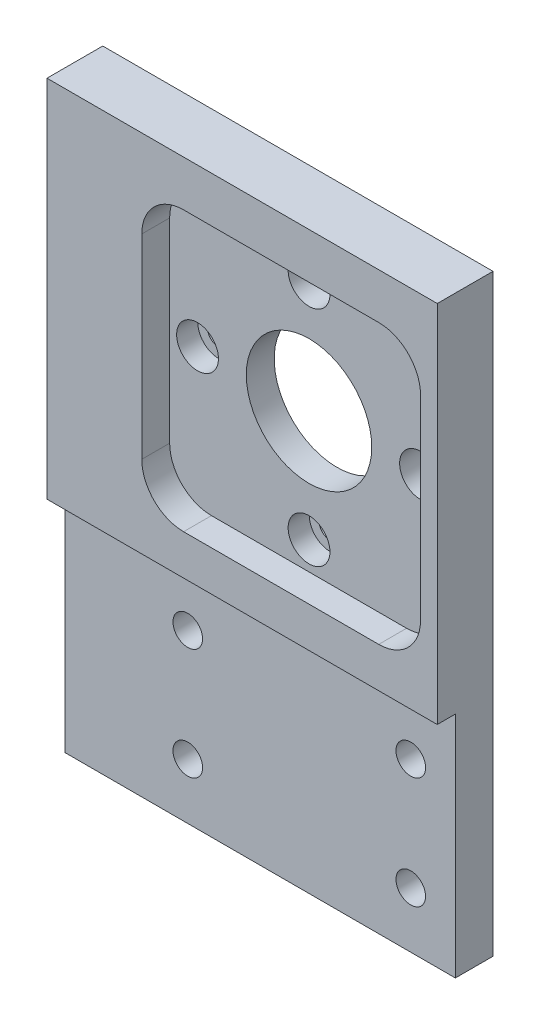
ISO-10303-21;
HEADER;
FILE_DESCRIPTION(('STEP AP214'),'2;1');
FILE_NAME('part.step','',(''),(''),'','','');
FILE_SCHEMA(('AUTOMOTIVE_DESIGN { 1 0 10303 214 1 1 1 1 }'));
ENDSEC;
DATA;
#1=APPLICATION_CONTEXT('core data for automotive mechanical design processes');
#2=APPLICATION_PROTOCOL_DEFINITION('international standard','automotive_design',2000,#1);
#3=PRODUCT_CONTEXT('',#1,'mechanical');
#4=PRODUCT('Part','Part','',(#3));
#5=PRODUCT_RELATED_PRODUCT_CATEGORY('part','',(#4));
#6=PRODUCT_DEFINITION_FORMATION('','',#4);
#7=PRODUCT_DEFINITION_CONTEXT('part definition',#1,'design');
#8=PRODUCT_DEFINITION('design','',#6,#7);
#9=PRODUCT_DEFINITION_SHAPE('','',#8);
#10=(LENGTH_UNIT() NAMED_UNIT(*) SI_UNIT(.MILLI.,.METRE.));
#11=(NAMED_UNIT(*) PLANE_ANGLE_UNIT() SI_UNIT($,.RADIAN.));
#12=(NAMED_UNIT(*) SI_UNIT($,.STERADIAN.) SOLID_ANGLE_UNIT());
#13=UNCERTAINTY_MEASURE_WITH_UNIT(LENGTH_MEASURE(1.E-05),#10,'distance_accuracy_value','');
#14=(GEOMETRIC_REPRESENTATION_CONTEXT(3) GLOBAL_UNCERTAINTY_ASSIGNED_CONTEXT((#13)) GLOBAL_UNIT_ASSIGNED_CONTEXT((#10,
#11,#12)) REPRESENTATION_CONTEXT('',''));
#15=CARTESIAN_POINT('',(0.,0.,0.));
#16=DIRECTION('',(0.,0.,1.));
#17=DIRECTION('',(1.,0.,0.));
#18=AXIS2_PLACEMENT_3D('',#15,#16,#17);
#19=CARTESIAN_POINT('',(0.,0.,12.7));
#20=DIRECTION('',(1.,0.,0.));
#21=DIRECTION('',(0.,1.,0.));
#22=AXIS2_PLACEMENT_3D('',#19,#20,#21);
#23=PLANE('',#22);
#24=DIRECTION('',(0.,-1.,0.));
#25=VECTOR('',#24,1.);
#26=CARTESIAN_POINT('',(0.,-135.128,8.5725));
#27=LINE('',#26,#25);
#28=CARTESIAN_POINT('',(0.,-83.058,8.5725));
#29=VERTEX_POINT('',#28);
#30=CARTESIAN_POINT('',(0.,-135.128,8.5725));
#31=VERTEX_POINT('',#30);
#32=EDGE_CURVE('E135',#29,#31,#27,.T.);
#33=ORIENTED_EDGE('',*,*,#32,.F.);
#34=DIRECTION('',(0.,0.,1.));
#35=VECTOR('',#34,1.);
#36=CARTESIAN_POINT('',(0.,-83.058,8.5725));
#37=LINE('',#36,#35);
#38=CARTESIAN_POINT('',(0.,-83.058,12.7));
#39=VERTEX_POINT('',#38);
#40=EDGE_CURVE('E305',#29,#39,#37,.T.);
#41=ORIENTED_EDGE('',*,*,#40,.T.);
#42=DIRECTION('',(0.,-1.,0.));
#43=VECTOR('',#42,1.);
#44=CARTESIAN_POINT('',(0.,0.,12.7));
#45=LINE('',#44,#43);
#46=CARTESIAN_POINT('',(0.,0.,12.7));
#47=VERTEX_POINT('',#46);
#48=EDGE_CURVE('E272',#47,#39,#45,.T.);
#49=ORIENTED_EDGE('',*,*,#48,.F.);
#50=DIRECTION('',(0.,0.,-1.));
#51=VECTOR('',#50,1.);
#52=CARTESIAN_POINT('',(0.,0.,12.7));
#53=LINE('',#52,#51);
#54=CARTESIAN_POINT('',(0.,0.,0.));
#55=VERTEX_POINT('',#54);
#56=EDGE_CURVE('E280',#47,#55,#53,.T.);
#57=ORIENTED_EDGE('',*,*,#56,.T.);
#58=DIRECTION('',(0.,-1.,0.));
#59=VECTOR('',#58,1.);
#60=CARTESIAN_POINT('',(0.,0.,0.));
#61=LINE('',#60,#59);
#62=CARTESIAN_POINT('',(0.,-135.128,0.));
#63=VERTEX_POINT('',#62);
#64=EDGE_CURVE('E159',#55,#63,#61,.T.);
#65=ORIENTED_EDGE('',*,*,#64,.T.);
#66=DIRECTION('',(0.,0.,-1.));
#67=VECTOR('',#66,1.);
#68=CARTESIAN_POINT('',(0.,-135.128,12.7));
#69=LINE('',#68,#67);
#70=EDGE_CURVE('E151',#31,#63,#69,.T.);
#71=ORIENTED_EDGE('',*,*,#70,.F.);
#72=EDGE_LOOP('',(#33,#41,#49,#57,#65,#71));
#73=FACE_BOUND('',#72,.T.);
#74=ADVANCED_FACE('F33',(#73),#23,.F.);
#75=CARTESIAN_POINT('',(0.,-135.128,12.7));
#76=DIRECTION('',(0.,1.,0.));
#77=DIRECTION('',(0.,0.,1.));
#78=AXIS2_PLACEMENT_3D('',#75,#76,#77);
#79=PLANE('',#78);
#80=DIRECTION('',(0.,0.,-1.));
#81=VECTOR('',#80,1.);
#82=CARTESIAN_POINT('',(88.9,-135.128,12.7));
#83=LINE('',#82,#81);
#84=CARTESIAN_POINT('',(88.9,-135.128,8.5725));
#85=VERTEX_POINT('',#84);
#86=CARTESIAN_POINT('',(88.9,-135.128,0.));
#87=VERTEX_POINT('',#86);
#88=EDGE_CURVE('E153',#85,#87,#83,.T.);
#89=ORIENTED_EDGE('',*,*,#88,.F.);
#90=DIRECTION('',(1.,0.,0.));
#91=VECTOR('',#90,1.);
#92=CARTESIAN_POINT('',(0.,-135.128,8.5725));
#93=LINE('',#92,#91);
#94=EDGE_CURVE('E139',#31,#85,#93,.T.);
#95=ORIENTED_EDGE('',*,*,#94,.F.);
#96=ORIENTED_EDGE('',*,*,#70,.T.);
#97=DIRECTION('',(1.,0.,0.));
#98=VECTOR('',#97,1.);
#99=CARTESIAN_POINT('',(0.,-135.128,0.));
#100=LINE('',#99,#98);
#101=EDGE_CURVE('E282',#63,#87,#100,.T.);
#102=ORIENTED_EDGE('',*,*,#101,.T.);
#103=EDGE_LOOP('',(#89,#95,#96,#102));
#104=FACE_BOUND('',#103,.T.);
#105=ADVANCED_FACE('F149',(#104),#79,.F.);
#106=CARTESIAN_POINT('',(88.9,0.,12.7));
#107=DIRECTION('',(-1.,0.,0.));
#108=DIRECTION('',(0.,-1.,0.));
#109=AXIS2_PLACEMENT_3D('',#106,#107,#108);
#110=PLANE('',#109);
#111=DIRECTION('',(0.,1.,0.));
#112=VECTOR('',#111,1.);
#113=CARTESIAN_POINT('',(88.9,0.,12.7));
#114=LINE('',#113,#112);
#115=CARTESIAN_POINT('',(88.9,-83.058,12.7));
#116=VERTEX_POINT('',#115);
#117=CARTESIAN_POINT('',(88.9,0.,12.7));
#118=VERTEX_POINT('',#117);
#119=EDGE_CURVE('E275',#116,#118,#114,.T.);
#120=ORIENTED_EDGE('',*,*,#119,.F.);
#121=DIRECTION('',(0.,0.,1.));
#122=VECTOR('',#121,1.);
#123=CARTESIAN_POINT('',(88.9,-83.058,8.5725));
#124=LINE('',#123,#122);
#125=CARTESIAN_POINT('',(88.9,-83.058,8.5725));
#126=VERTEX_POINT('',#125);
#127=EDGE_CURVE('E49',#126,#116,#124,.T.);
#128=ORIENTED_EDGE('',*,*,#127,.F.);
#129=DIRECTION('',(0.,1.,0.));
#130=VECTOR('',#129,1.);
#131=CARTESIAN_POINT('',(88.9,-135.128,8.5725));
#132=LINE('',#131,#130);
#133=EDGE_CURVE('E154',#85,#126,#132,.T.);
#134=ORIENTED_EDGE('',*,*,#133,.F.);
#135=ORIENTED_EDGE('',*,*,#88,.T.);
#136=DIRECTION('',(0.,1.,0.));
#137=VECTOR('',#136,1.);
#138=CARTESIAN_POINT('',(88.9,0.,0.));
#139=LINE('',#138,#137);
#140=CARTESIAN_POINT('',(88.9,0.,0.));
#141=VERTEX_POINT('',#140);
#142=EDGE_CURVE('E284',#87,#141,#139,.T.);
#143=ORIENTED_EDGE('',*,*,#142,.T.);
#144=DIRECTION('',(0.,0.,-1.));
#145=VECTOR('',#144,1.);
#146=CARTESIAN_POINT('',(88.9,0.,12.7));
#147=LINE('',#146,#145);
#148=EDGE_CURVE('E164',#118,#141,#147,.T.);
#149=ORIENTED_EDGE('',*,*,#148,.F.);
#150=EDGE_LOOP('',(#120,#128,#134,#135,#143,#149));
#151=FACE_BOUND('',#150,.T.);
#152=ADVANCED_FACE('F299',(#151),#110,.F.);
#153=CARTESIAN_POINT('',(0.,0.,12.7));
#154=DIRECTION('',(0.,-1.,0.));
#155=DIRECTION('',(0.,0.,-1.));
#156=AXIS2_PLACEMENT_3D('',#153,#154,#155);
#157=PLANE('',#156);
#158=DIRECTION('',(-1.,0.,0.));
#159=VECTOR('',#158,1.);
#160=CARTESIAN_POINT('',(0.,0.,0.));
#161=LINE('',#160,#159);
#162=EDGE_CURVE('E276',#141,#55,#161,.T.);
#163=ORIENTED_EDGE('',*,*,#162,.T.);
#164=ORIENTED_EDGE('',*,*,#56,.F.);
#165=DIRECTION('',(-1.,0.,0.));
#166=VECTOR('',#165,1.);
#167=CARTESIAN_POINT('',(0.,0.,12.7));
#168=LINE('',#167,#166);
#169=EDGE_CURVE('E278',#118,#47,#168,.T.);
#170=ORIENTED_EDGE('',*,*,#169,.F.);
#171=ORIENTED_EDGE('',*,*,#148,.T.);
#172=EDGE_LOOP('',(#163,#164,#170,#171));
#173=FACE_BOUND('',#172,.T.);
#174=ADVANCED_FACE('F292',(#173),#157,.F.);
#175=CARTESIAN_POINT('',(0.,0.,12.7));
#176=DIRECTION('',(0.,0.,1.));
#177=DIRECTION('',(1.,0.,0.));
#178=AXIS2_PLACEMENT_3D('',#175,#176,#177);
#179=PLANE('',#178);
#180=DIRECTION('',(-1.,0.,0.));
#181=VECTOR('',#180,1.);
#182=CARTESIAN_POINT('',(0.,-83.058,12.7));
#183=LINE('',#182,#181);
#184=EDGE_CURVE('E145',#116,#39,#183,.T.);
#185=ORIENTED_EDGE('',*,*,#184,.F.);
#186=ORIENTED_EDGE('',*,*,#119,.T.);
#187=ORIENTED_EDGE('',*,*,#169,.T.);
#188=ORIENTED_EDGE('',*,*,#48,.T.);
#189=EDGE_LOOP('',(#185,#186,#187,#188));
#190=FACE_BOUND('',#189,.T.);
#191=DIRECTION('',(0.,1.,0.));
#192=VECTOR('',#191,1.);
#193=CARTESIAN_POINT('',(85.09,-73.914,12.7));
#194=LINE('',#193,#192);
#195=CARTESIAN_POINT('',(85.09,-64.389,12.7));
#196=VERTEX_POINT('',#195);
#197=CARTESIAN_POINT('',(85.09,-19.939,12.7));
#198=VERTEX_POINT('',#197);
#199=EDGE_CURVE('E200',#196,#198,#194,.T.);
#200=ORIENTED_EDGE('',*,*,#199,.F.);
#201=CARTESIAN_POINT('',(75.565,-64.389,12.7));
#202=DIRECTION('',(0.,0.,1.));
#203=DIRECTION('',(1.,0.,0.));
#204=AXIS2_PLACEMENT_3D('',#201,#202,#203);
#205=CIRCLE('',#204,9.525);
#206=CARTESIAN_POINT('',(75.565,-73.914,12.7));
#207=VERTEX_POINT('',#206);
#208=EDGE_CURVE('E195',#196,#207,#205,.F.);
#209=ORIENTED_EDGE('',*,*,#208,.T.);
#210=DIRECTION('',(1.,0.,0.));
#211=VECTOR('',#210,1.);
#212=CARTESIAN_POINT('',(21.59,-73.914,12.7));
#213=LINE('',#212,#211);
#214=CARTESIAN_POINT('',(31.115,-73.914,12.7));
#215=VERTEX_POINT('',#214);
#216=EDGE_CURVE('E230',#215,#207,#213,.T.);
#217=ORIENTED_EDGE('',*,*,#216,.F.);
#218=CARTESIAN_POINT('',(31.115,-64.389,12.7));
#219=DIRECTION('',(0.,0.,1.));
#220=DIRECTION('',(1.,0.,0.));
#221=AXIS2_PLACEMENT_3D('',#218,#219,#220);
#222=CIRCLE('',#221,9.525);
#223=CARTESIAN_POINT('',(21.59,-64.389,12.7));
#224=VERTEX_POINT('',#223);
#225=EDGE_CURVE('E193',#215,#224,#222,.F.);
#226=ORIENTED_EDGE('',*,*,#225,.T.);
#227=DIRECTION('',(0.,-1.,0.));
#228=VECTOR('',#227,1.);
#229=CARTESIAN_POINT('',(21.59,-73.914,12.7));
#230=LINE('',#229,#228);
#231=CARTESIAN_POINT('',(21.59,-19.939,12.7));
#232=VERTEX_POINT('',#231);
#233=EDGE_CURVE('E238',#232,#224,#230,.T.);
#234=ORIENTED_EDGE('',*,*,#233,.F.);
#235=CARTESIAN_POINT('',(31.115,-19.939,12.7));
#236=DIRECTION('',(0.,0.,1.));
#237=DIRECTION('',(1.,0.,0.));
#238=AXIS2_PLACEMENT_3D('',#235,#236,#237);
#239=CIRCLE('',#238,9.525);
#240=CARTESIAN_POINT('',(31.115,-10.414,12.7));
#241=VERTEX_POINT('',#240);
#242=EDGE_CURVE('E11',#232,#241,#239,.F.);
#243=ORIENTED_EDGE('',*,*,#242,.T.);
#244=DIRECTION('',(-1.,0.,0.));
#245=VECTOR('',#244,1.);
#246=CARTESIAN_POINT('',(21.59,-10.414,12.7));
#247=LINE('',#246,#245);
#248=CARTESIAN_POINT('',(75.565,-10.414,12.7));
#249=VERTEX_POINT('',#248);
#250=EDGE_CURVE('E201',#249,#241,#247,.T.);
#251=ORIENTED_EDGE('',*,*,#250,.F.);
#252=CARTESIAN_POINT('',(75.565,-19.939,12.7));
#253=DIRECTION('',(0.,0.,1.));
#254=DIRECTION('',(1.,0.,0.));
#255=AXIS2_PLACEMENT_3D('',#252,#253,#254);
#256=CIRCLE('',#255,9.525);
#257=EDGE_CURVE('E42',#249,#198,#256,.F.);
#258=ORIENTED_EDGE('',*,*,#257,.T.);
#259=EDGE_LOOP('',(#200,#209,#217,#226,#234,#243,#251,#258));
#260=FACE_BOUND('',#259,.T.);
#261=ADVANCED_FACE('F199',(#190,#260),#179,.T.);
#262=CARTESIAN_POINT('',(0.,0.,0.));
#263=DIRECTION('',(0.,0.,1.));
#264=DIRECTION('',(1.,0.,0.));
#265=AXIS2_PLACEMENT_3D('',#262,#263,#264);
#266=PLANE('',#265);
#267=CARTESIAN_POINT('',(27.94,-122.428,0.));
#268=DIRECTION('',(0.,0.,1.));
#269=DIRECTION('',(1.,0.,0.));
#270=AXIS2_PLACEMENT_3D('',#267,#268,#269);
#271=CIRCLE('',#270,3.37343750000001);
#272=CARTESIAN_POINT('',(31.3134375,-122.428,0.));
#273=VERTEX_POINT('',#272);
#274=EDGE_CURVE('E246',#273,#273,#271,.T.);
#275=ORIENTED_EDGE('',*,*,#274,.T.);
#276=EDGE_LOOP('',(#275));
#277=FACE_BOUND('',#276,.T.);
#278=CARTESIAN_POINT('',(78.74,-97.028,0.));
#279=DIRECTION('',(0.,0.,1.));
#280=DIRECTION('',(1.,0.,0.));
#281=AXIS2_PLACEMENT_3D('',#278,#279,#280);
#282=CIRCLE('',#281,3.3734375);
#283=CARTESIAN_POINT('',(82.1134375,-97.028,0.));
#284=VERTEX_POINT('',#283);
#285=EDGE_CURVE('E250',#284,#284,#282,.T.);
#286=ORIENTED_EDGE('',*,*,#285,.T.);
#287=EDGE_LOOP('',(#286));
#288=FACE_BOUND('',#287,.T.);
#289=CARTESIAN_POINT('',(27.94,-97.028,0.));
#290=DIRECTION('',(0.,0.,1.));
#291=DIRECTION('',(1.,0.,0.));
#292=AXIS2_PLACEMENT_3D('',#289,#290,#291);
#293=CIRCLE('',#292,3.37343750000001);
#294=CARTESIAN_POINT('',(31.3134375,-97.028,0.));
#295=VERTEX_POINT('',#294);
#296=EDGE_CURVE('E245',#295,#295,#293,.T.);
#297=ORIENTED_EDGE('',*,*,#296,.T.);
#298=EDGE_LOOP('',(#297));
#299=FACE_BOUND('',#298,.T.);
#300=CARTESIAN_POINT('',(78.74,-122.428,0.));
#301=DIRECTION('',(0.,0.,1.));
#302=DIRECTION('',(1.,0.,0.));
#303=AXIS2_PLACEMENT_3D('',#300,#301,#302);
#304=CIRCLE('',#303,3.3734375);
#305=CARTESIAN_POINT('',(82.1134375,-122.428,0.));
#306=VERTEX_POINT('',#305);
#307=EDGE_CURVE('E249',#306,#306,#304,.T.);
#308=ORIENTED_EDGE('',*,*,#307,.T.);
#309=EDGE_LOOP('',(#308));
#310=FACE_BOUND('',#309,.T.);
#311=CARTESIAN_POINT('',(53.34,-16.764,0.));
#312=DIRECTION('',(0.,0.,1.));
#313=DIRECTION('',(1.,0.,0.));
#314=AXIS2_PLACEMENT_3D('',#311,#312,#313);
#315=CIRCLE('',#314,2.5527);
#316=CARTESIAN_POINT('',(55.8927,-16.764,0.));
#317=VERTEX_POINT('',#316);
#318=EDGE_CURVE('E257',#317,#317,#315,.T.);
#319=ORIENTED_EDGE('',*,*,#318,.T.);
#320=EDGE_LOOP('',(#319));
#321=FACE_BOUND('',#320,.T.);
#322=CARTESIAN_POINT('',(53.34,-67.564,0.));
#323=DIRECTION('',(0.,0.,1.));
#324=DIRECTION('',(1.,0.,0.));
#325=AXIS2_PLACEMENT_3D('',#322,#323,#324);
#326=CIRCLE('',#325,2.5527);
#327=CARTESIAN_POINT('',(55.8927,-67.564,0.));
#328=VERTEX_POINT('',#327);
#329=EDGE_CURVE('E260',#328,#328,#326,.T.);
#330=ORIENTED_EDGE('',*,*,#329,.T.);
#331=EDGE_LOOP('',(#330));
#332=FACE_BOUND('',#331,.T.);
#333=CARTESIAN_POINT('',(27.94,-42.164,0.));
#334=DIRECTION('',(0.,0.,1.));
#335=DIRECTION('',(1.,0.,0.));
#336=AXIS2_PLACEMENT_3D('',#333,#334,#335);
#337=CIRCLE('',#336,2.5527);
#338=CARTESIAN_POINT('',(30.4927,-42.164,0.));
#339=VERTEX_POINT('',#338);
#340=EDGE_CURVE('E263',#339,#339,#337,.T.);
#341=ORIENTED_EDGE('',*,*,#340,.T.);
#342=EDGE_LOOP('',(#341));
#343=FACE_BOUND('',#342,.T.);
#344=CARTESIAN_POINT('',(78.74,-42.164,0.));
#345=DIRECTION('',(0.,0.,1.));
#346=DIRECTION('',(1.,0.,0.));
#347=AXIS2_PLACEMENT_3D('',#344,#345,#346);
#348=CIRCLE('',#347,2.55269999999999);
#349=CARTESIAN_POINT('',(81.2927,-42.164,0.));
#350=VERTEX_POINT('',#349);
#351=EDGE_CURVE('E266',#350,#350,#348,.T.);
#352=ORIENTED_EDGE('',*,*,#351,.T.);
#353=EDGE_LOOP('',(#352));
#354=FACE_BOUND('',#353,.T.);
#355=CARTESIAN_POINT('',(53.34,-42.164,0.));
#356=DIRECTION('',(0.,0.,1.));
#357=DIRECTION('',(1.,0.,0.));
#358=AXIS2_PLACEMENT_3D('',#355,#356,#357);
#359=CIRCLE('',#358,14.2875);
#360=CARTESIAN_POINT('',(67.6275,-42.164,0.));
#361=VERTEX_POINT('',#360);
#362=EDGE_CURVE('E269',#361,#361,#359,.T.);
#363=ORIENTED_EDGE('',*,*,#362,.T.);
#364=EDGE_LOOP('',(#363));
#365=FACE_BOUND('',#364,.T.);
#366=ORIENTED_EDGE('',*,*,#64,.F.);
#367=ORIENTED_EDGE('',*,*,#162,.F.);
#368=ORIENTED_EDGE('',*,*,#142,.F.);
#369=ORIENTED_EDGE('',*,*,#101,.F.);
#370=EDGE_LOOP('',(#366,#367,#368,#369));
#371=FACE_BOUND('',#370,.T.);
#372=ADVANCED_FACE('F298',(#277,#288,#299,#310,#321,#332,#343,#354,#365,#371),#266,.F.);
#373=CARTESIAN_POINT('',(53.34,-42.164,0.));
#374=DIRECTION('',(0.,0.,1.));
#375=DIRECTION('',(1.,0.,0.));
#376=AXIS2_PLACEMENT_3D('',#373,#374,#375);
#377=CYLINDRICAL_SURFACE('',#376,14.2875);
#378=CARTESIAN_POINT('',(53.34,-42.164,6.35));
#379=DIRECTION('',(0.,0.,-1.));
#380=DIRECTION('',(-1.,0.,0.));
#381=AXIS2_PLACEMENT_3D('',#378,#379,#380);
#382=CIRCLE('',#381,14.2875);
#383=CARTESIAN_POINT('',(39.0525,-42.164,6.35));
#384=VERTEX_POINT('',#383);
#385=EDGE_CURVE('E235',#384,#384,#382,.F.);
#386=ORIENTED_EDGE('',*,*,#385,.T.);
#387=EDGE_LOOP('',(#386));
#388=FACE_BOUND('',#387,.T.);
#389=ORIENTED_EDGE('',*,*,#362,.F.);
#390=EDGE_LOOP('',(#389));
#391=FACE_BOUND('',#390,.T.);
#392=ADVANCED_FACE('F453',(#388,#391),#377,.F.);
#393=CARTESIAN_POINT('',(78.74,-42.164,12.7));
#394=DIRECTION('',(0.,0.,1.));
#395=DIRECTION('',(1.,0.,0.));
#396=AXIS2_PLACEMENT_3D('',#393,#394,#395);
#397=CYLINDRICAL_SURFACE('',#396,2.5527);
#398=CARTESIAN_POINT('',(78.74,-42.164,1.524));
#399=DIRECTION('',(0.,0.,1.));
#400=DIRECTION('',(1.,0.,0.));
#401=AXIS2_PLACEMENT_3D('',#398,#399,#400);
#402=CIRCLE('',#401,2.55269999999999);
#403=CARTESIAN_POINT('',(81.2927,-42.164,1.524));
#404=VERTEX_POINT('',#403);
#405=EDGE_CURVE('E590',#404,#404,#402,.T.);
#406=ORIENTED_EDGE('',*,*,#405,.T.);
#407=EDGE_LOOP('',(#406));
#408=FACE_BOUND('',#407,.T.);
#409=ORIENTED_EDGE('',*,*,#351,.F.);
#410=EDGE_LOOP('',(#409));
#411=FACE_BOUND('',#410,.T.);
#412=ADVANCED_FACE('F447',(#408,#411),#397,.F.);
#413=CARTESIAN_POINT('',(27.94,-42.164,12.7));
#414=DIRECTION('',(0.,0.,1.));
#415=DIRECTION('',(1.,0.,0.));
#416=AXIS2_PLACEMENT_3D('',#413,#414,#415);
#417=CYLINDRICAL_SURFACE('',#416,2.5527);
#418=CARTESIAN_POINT('',(27.94,-42.164,1.524));
#419=DIRECTION('',(0.,0.,1.));
#420=DIRECTION('',(1.,0.,0.));
#421=AXIS2_PLACEMENT_3D('',#418,#419,#420);
#422=CIRCLE('',#421,2.55269999999999);
#423=CARTESIAN_POINT('',(30.4927,-42.164,1.524));
#424=VERTEX_POINT('',#423);
#425=EDGE_CURVE('E304',#424,#424,#422,.T.);
#426=ORIENTED_EDGE('',*,*,#425,.T.);
#427=EDGE_LOOP('',(#426));
#428=FACE_BOUND('',#427,.T.);
#429=ORIENTED_EDGE('',*,*,#340,.F.);
#430=EDGE_LOOP('',(#429));
#431=FACE_BOUND('',#430,.T.);
#432=ADVANCED_FACE('F452',(#428,#431),#417,.F.);
#433=CARTESIAN_POINT('',(53.34,-67.564,12.7));
#434=DIRECTION('',(0.,0.,1.));
#435=DIRECTION('',(1.,0.,0.));
#436=AXIS2_PLACEMENT_3D('',#433,#434,#435);
#437=CYLINDRICAL_SURFACE('',#436,2.5527);
#438=CARTESIAN_POINT('',(53.34,-67.564,1.524));
#439=DIRECTION('',(0.,0.,1.));
#440=DIRECTION('',(1.,0.,0.));
#441=AXIS2_PLACEMENT_3D('',#438,#439,#440);
#442=CIRCLE('',#441,2.5527);
#443=CARTESIAN_POINT('',(55.8927,-67.564,1.524));
#444=VERTEX_POINT('',#443);
#445=EDGE_CURVE('E599',#444,#444,#442,.T.);
#446=ORIENTED_EDGE('',*,*,#445,.T.);
#447=EDGE_LOOP('',(#446));
#448=FACE_BOUND('',#447,.T.);
#449=ORIENTED_EDGE('',*,*,#329,.F.);
#450=EDGE_LOOP('',(#449));
#451=FACE_BOUND('',#450,.T.);
#452=ADVANCED_FACE('F465',(#448,#451),#437,.F.);
#453=CARTESIAN_POINT('',(53.34,-16.764,12.7));
#454=DIRECTION('',(0.,0.,1.));
#455=DIRECTION('',(1.,0.,0.));
#456=AXIS2_PLACEMENT_3D('',#453,#454,#455);
#457=CYLINDRICAL_SURFACE('',#456,2.5527);
#458=CARTESIAN_POINT('',(53.34,-16.764,1.524));
#459=DIRECTION('',(0.,0.,1.));
#460=DIRECTION('',(1.,0.,0.));
#461=AXIS2_PLACEMENT_3D('',#458,#459,#460);
#462=CIRCLE('',#461,2.5527);
#463=CARTESIAN_POINT('',(55.8927,-16.764,1.524));
#464=VERTEX_POINT('',#463);
#465=EDGE_CURVE('E579',#464,#464,#462,.T.);
#466=ORIENTED_EDGE('',*,*,#465,.T.);
#467=EDGE_LOOP('',(#466));
#468=FACE_BOUND('',#467,.T.);
#469=ORIENTED_EDGE('',*,*,#318,.F.);
#470=EDGE_LOOP('',(#469));
#471=FACE_BOUND('',#470,.T.);
#472=ADVANCED_FACE('F398',(#468,#471),#457,.F.);
#473=CARTESIAN_POINT('',(78.74,-122.428,0.));
#474=DIRECTION('',(0.,0.,1.));
#475=DIRECTION('',(1.,0.,0.));
#476=AXIS2_PLACEMENT_3D('',#473,#474,#475);
#477=CYLINDRICAL_SURFACE('',#476,3.3734375);
#478=CARTESIAN_POINT('',(78.74,-122.428,8.5725));
#479=DIRECTION('',(0.,0.,-1.));
#480=DIRECTION('',(-1.,0.,0.));
#481=AXIS2_PLACEMENT_3D('',#478,#479,#480);
#482=CIRCLE('',#481,3.3734375);
#483=CARTESIAN_POINT('',(75.3665625,-122.428,8.5725));
#484=VERTEX_POINT('',#483);
#485=EDGE_CURVE('E210',#484,#484,#482,.F.);
#486=ORIENTED_EDGE('',*,*,#485,.T.);
#487=EDGE_LOOP('',(#486));
#488=FACE_BOUND('',#487,.T.);
#489=ORIENTED_EDGE('',*,*,#307,.F.);
#490=EDGE_LOOP('',(#489));
#491=FACE_BOUND('',#490,.T.);
#492=ADVANCED_FACE('F316',(#488,#491),#477,.F.);
#493=CARTESIAN_POINT('',(27.94,-97.028,0.));
#494=DIRECTION('',(0.,0.,1.));
#495=DIRECTION('',(1.,0.,0.));
#496=AXIS2_PLACEMENT_3D('',#493,#494,#495);
#497=CYLINDRICAL_SURFACE('',#496,3.37343750000001);
#498=CARTESIAN_POINT('',(27.94,-97.028,8.5725));
#499=DIRECTION('',(0.,0.,-1.));
#500=DIRECTION('',(-1.,0.,0.));
#501=AXIS2_PLACEMENT_3D('',#498,#499,#500);
#502=CIRCLE('',#501,3.37343750000001);
#503=CARTESIAN_POINT('',(24.5665625,-97.028,8.5725));
#504=VERTEX_POINT('',#503);
#505=EDGE_CURVE('E311',#504,#504,#502,.F.);
#506=ORIENTED_EDGE('',*,*,#505,.T.);
#507=EDGE_LOOP('',(#506));
#508=FACE_BOUND('',#507,.T.);
#509=ORIENTED_EDGE('',*,*,#296,.F.);
#510=EDGE_LOOP('',(#509));
#511=FACE_BOUND('',#510,.T.);
#512=ADVANCED_FACE('F397',(#508,#511),#497,.F.);
#513=CARTESIAN_POINT('',(78.74,-97.028,0.));
#514=DIRECTION('',(0.,0.,1.));
#515=DIRECTION('',(1.,0.,0.));
#516=AXIS2_PLACEMENT_3D('',#513,#514,#515);
#517=CYLINDRICAL_SURFACE('',#516,3.3734375);
#518=CARTESIAN_POINT('',(78.74,-97.028,8.5725));
#519=DIRECTION('',(0.,0.,-1.));
#520=DIRECTION('',(-1.,0.,0.));
#521=AXIS2_PLACEMENT_3D('',#518,#519,#520);
#522=CIRCLE('',#521,3.3734375);
#523=CARTESIAN_POINT('',(75.3665625,-97.028,8.5725));
#524=VERTEX_POINT('',#523);
#525=EDGE_CURVE('E308',#524,#524,#522,.F.);
#526=ORIENTED_EDGE('',*,*,#525,.T.);
#527=EDGE_LOOP('',(#526));
#528=FACE_BOUND('',#527,.T.);
#529=ORIENTED_EDGE('',*,*,#285,.F.);
#530=EDGE_LOOP('',(#529));
#531=FACE_BOUND('',#530,.T.);
#532=ADVANCED_FACE('F409',(#528,#531),#517,.F.);
#533=CARTESIAN_POINT('',(27.94,-122.428,0.));
#534=DIRECTION('',(0.,0.,1.));
#535=DIRECTION('',(1.,0.,0.));
#536=AXIS2_PLACEMENT_3D('',#533,#534,#535);
#537=CYLINDRICAL_SURFACE('',#536,3.37343750000001);
#538=CARTESIAN_POINT('',(27.94,-122.428,8.5725));
#539=DIRECTION('',(0.,0.,-1.));
#540=DIRECTION('',(-1.,0.,0.));
#541=AXIS2_PLACEMENT_3D('',#538,#539,#540);
#542=CIRCLE('',#541,3.37343750000001);
#543=CARTESIAN_POINT('',(24.5665625,-122.428,8.5725));
#544=VERTEX_POINT('',#543);
#545=EDGE_CURVE('E37',#544,#544,#542,.F.);
#546=ORIENTED_EDGE('',*,*,#545,.T.);
#547=EDGE_LOOP('',(#546));
#548=FACE_BOUND('',#547,.T.);
#549=ORIENTED_EDGE('',*,*,#274,.F.);
#550=EDGE_LOOP('',(#549));
#551=FACE_BOUND('',#550,.T.);
#552=ADVANCED_FACE('F419',(#548,#551),#537,.F.);
#553=CARTESIAN_POINT('',(0.,0.,6.35));
#554=DIRECTION('',(0.,0.,-1.));
#555=DIRECTION('',(-1.,0.,0.));
#556=AXIS2_PLACEMENT_3D('',#553,#554,#555);
#557=PLANE('',#556);
#558=CARTESIAN_POINT('',(53.34,-16.764,6.35));
#559=DIRECTION('',(0.,0.,1.));
#560=DIRECTION('',(1.,0.,0.));
#561=AXIS2_PLACEMENT_3D('',#558,#559,#560);
#562=CIRCLE('',#561,4.7625);
#563=CARTESIAN_POINT('',(58.1025,-16.764,6.35));
#564=VERTEX_POINT('',#563);
#565=EDGE_CURVE('E577',#564,#564,#562,.T.);
#566=ORIENTED_EDGE('',*,*,#565,.F.);
#567=EDGE_LOOP('',(#566));
#568=FACE_BOUND('',#567,.T.);
#569=CARTESIAN_POINT('',(78.74,-42.164,6.35));
#570=DIRECTION('',(0.,0.,1.));
#571=DIRECTION('',(1.,0.,0.));
#572=AXIS2_PLACEMENT_3D('',#569,#570,#571);
#573=CIRCLE('',#572,4.76249999999999);
#574=CARTESIAN_POINT('',(83.5025,-42.164,6.35));
#575=VERTEX_POINT('',#574);
#576=EDGE_CURVE('E584',#575,#575,#573,.T.);
#577=ORIENTED_EDGE('',*,*,#576,.F.);
#578=EDGE_LOOP('',(#577));
#579=FACE_BOUND('',#578,.T.);
#580=CARTESIAN_POINT('',(53.34,-67.564,6.35));
#581=DIRECTION('',(0.,0.,1.));
#582=DIRECTION('',(1.,0.,0.));
#583=AXIS2_PLACEMENT_3D('',#580,#581,#582);
#584=CIRCLE('',#583,4.7625);
#585=CARTESIAN_POINT('',(58.1025,-67.564,6.35));
#586=VERTEX_POINT('',#585);
#587=EDGE_CURVE('E593',#586,#586,#584,.T.);
#588=ORIENTED_EDGE('',*,*,#587,.F.);
#589=EDGE_LOOP('',(#588));
#590=FACE_BOUND('',#589,.T.);
#591=CARTESIAN_POINT('',(27.94,-42.164,6.35));
#592=DIRECTION('',(0.,0.,1.));
#593=DIRECTION('',(1.,0.,0.));
#594=AXIS2_PLACEMENT_3D('',#591,#592,#593);
#595=CIRCLE('',#594,4.7625);
#596=CARTESIAN_POINT('',(32.7025,-42.164,6.35));
#597=VERTEX_POINT('',#596);
#598=EDGE_CURVE('E602',#597,#597,#595,.T.);
#599=ORIENTED_EDGE('',*,*,#598,.F.);
#600=EDGE_LOOP('',(#599));
#601=FACE_BOUND('',#600,.T.);
#602=DIRECTION('',(0.,-1.,0.));
#603=VECTOR('',#602,1.);
#604=CARTESIAN_POINT('',(21.59,-73.914,6.35));
#605=LINE('',#604,#603);
#606=CARTESIAN_POINT('',(21.59,-19.939,6.35));
#607=VERTEX_POINT('',#606);
#608=CARTESIAN_POINT('',(21.59,-64.389,6.35));
#609=VERTEX_POINT('',#608);
#610=EDGE_CURVE('E226',#607,#609,#605,.T.);
#611=ORIENTED_EDGE('',*,*,#610,.T.);
#612=CARTESIAN_POINT('',(31.115,-64.389,6.35));
#613=DIRECTION('',(0.,0.,-1.));
#614=DIRECTION('',(-1.,0.,0.));
#615=AXIS2_PLACEMENT_3D('',#612,#613,#614);
#616=CIRCLE('',#615,9.525);
#617=CARTESIAN_POINT('',(31.115,-73.914,6.35));
#618=VERTEX_POINT('',#617);
#619=EDGE_CURVE('E181',#609,#618,#616,.F.);
#620=ORIENTED_EDGE('',*,*,#619,.T.);
#621=DIRECTION('',(1.,0.,0.));
#622=VECTOR('',#621,1.);
#623=CARTESIAN_POINT('',(21.59,-73.914,6.35));
#624=LINE('',#623,#622);
#625=CARTESIAN_POINT('',(75.565,-73.914,6.35));
#626=VERTEX_POINT('',#625);
#627=EDGE_CURVE('E228',#618,#626,#624,.T.);
#628=ORIENTED_EDGE('',*,*,#627,.T.);
#629=CARTESIAN_POINT('',(75.565,-64.389,6.35));
#630=DIRECTION('',(0.,0.,-1.));
#631=DIRECTION('',(-1.,0.,0.));
#632=AXIS2_PLACEMENT_3D('',#629,#630,#631);
#633=CIRCLE('',#632,9.525);
#634=CARTESIAN_POINT('',(85.09,-64.389,6.35));
#635=VERTEX_POINT('',#634);
#636=EDGE_CURVE('E179',#626,#635,#633,.F.);
#637=ORIENTED_EDGE('',*,*,#636,.T.);
#638=DIRECTION('',(0.,1.,0.));
#639=VECTOR('',#638,1.);
#640=CARTESIAN_POINT('',(85.09,-73.914,6.35));
#641=LINE('',#640,#639);
#642=CARTESIAN_POINT('',(85.09,-19.939,6.35));
#643=VERTEX_POINT('',#642);
#644=EDGE_CURVE('E222',#635,#643,#641,.T.);
#645=ORIENTED_EDGE('',*,*,#644,.T.);
#646=CARTESIAN_POINT('',(75.565,-19.939,6.35));
#647=DIRECTION('',(0.,0.,-1.));
#648=DIRECTION('',(-1.,0.,0.));
#649=AXIS2_PLACEMENT_3D('',#646,#647,#648);
#650=CIRCLE('',#649,9.525);
#651=CARTESIAN_POINT('',(75.565,-10.414,6.35));
#652=VERTEX_POINT('',#651);
#653=EDGE_CURVE('E177',#643,#652,#650,.F.);
#654=ORIENTED_EDGE('',*,*,#653,.T.);
#655=DIRECTION('',(-1.,0.,0.));
#656=VECTOR('',#655,1.);
#657=CARTESIAN_POINT('',(21.59,-10.414,6.35));
#658=LINE('',#657,#656);
#659=CARTESIAN_POINT('',(31.115,-10.414,6.35));
#660=VERTEX_POINT('',#659);
#661=EDGE_CURVE('E220',#652,#660,#658,.T.);
#662=ORIENTED_EDGE('',*,*,#661,.T.);
#663=CARTESIAN_POINT('',(31.115,-19.939,6.35));
#664=DIRECTION('',(0.,0.,-1.));
#665=DIRECTION('',(-1.,0.,0.));
#666=AXIS2_PLACEMENT_3D('',#663,#664,#665);
#667=CIRCLE('',#666,9.525);
#668=EDGE_CURVE('E175',#660,#607,#667,.F.);
#669=ORIENTED_EDGE('',*,*,#668,.T.);
#670=EDGE_LOOP('',(#611,#620,#628,#637,#645,#654,#662,#669));
#671=FACE_BOUND('',#670,.T.);
#672=ORIENTED_EDGE('',*,*,#385,.F.);
#673=EDGE_LOOP('',(#672));
#674=FACE_BOUND('',#673,.T.);
#675=ADVANCED_FACE('F218',(#568,#579,#590,#601,#671,#674),#557,.F.);
#676=CARTESIAN_POINT('',(85.09,-73.914,6.35));
#677=DIRECTION('',(1.,0.,0.));
#678=DIRECTION('',(0.,0.,-1.));
#679=AXIS2_PLACEMENT_3D('',#676,#677,#678);
#680=PLANE('',#679);
#681=ORIENTED_EDGE('',*,*,#644,.F.);
#682=DIRECTION('',(0.,0.,1.));
#683=VECTOR('',#682,1.);
#684=CARTESIAN_POINT('',(85.09,-64.389,12.7));
#685=LINE('',#684,#683);
#686=EDGE_CURVE('E185',#635,#196,#685,.T.);
#687=ORIENTED_EDGE('',*,*,#686,.T.);
#688=ORIENTED_EDGE('',*,*,#199,.T.);
#689=DIRECTION('',(0.,0.,1.));
#690=VECTOR('',#689,1.);
#691=CARTESIAN_POINT('',(85.09,-19.939,6.35));
#692=LINE('',#691,#690);
#693=EDGE_CURVE('E183',#198,#643,#692,.F.);
#694=ORIENTED_EDGE('',*,*,#693,.T.);
#695=EDGE_LOOP('',(#681,#687,#688,#694));
#696=FACE_BOUND('',#695,.T.);
#697=ADVANCED_FACE('F207',(#696),#680,.F.);
#698=CARTESIAN_POINT('',(21.59,-73.914,6.35));
#699=DIRECTION('',(0.,-1.,0.));
#700=DIRECTION('',(0.,0.,-1.));
#701=AXIS2_PLACEMENT_3D('',#698,#699,#700);
#702=PLANE('',#701);
#703=ORIENTED_EDGE('',*,*,#627,.F.);
#704=DIRECTION('',(0.,0.,1.));
#705=VECTOR('',#704,1.);
#706=CARTESIAN_POINT('',(31.115,-73.914,12.7));
#707=LINE('',#706,#705);
#708=EDGE_CURVE('E162',#618,#215,#707,.T.);
#709=ORIENTED_EDGE('',*,*,#708,.T.);
#710=ORIENTED_EDGE('',*,*,#216,.T.);
#711=DIRECTION('',(0.,0.,1.));
#712=VECTOR('',#711,1.);
#713=CARTESIAN_POINT('',(75.565,-73.914,6.35));
#714=LINE('',#713,#712);
#715=EDGE_CURVE('E160',#207,#626,#714,.F.);
#716=ORIENTED_EDGE('',*,*,#715,.T.);
#717=EDGE_LOOP('',(#703,#709,#710,#716));
#718=FACE_BOUND('',#717,.T.);
#719=ADVANCED_FACE('F646',(#718),#702,.F.);
#720=CARTESIAN_POINT('',(21.59,-73.914,6.35));
#721=DIRECTION('',(-1.,0.,0.));
#722=DIRECTION('',(0.,0.,1.));
#723=AXIS2_PLACEMENT_3D('',#720,#721,#722);
#724=PLANE('',#723);
#725=ORIENTED_EDGE('',*,*,#233,.T.);
#726=DIRECTION('',(0.,0.,1.));
#727=VECTOR('',#726,1.);
#728=CARTESIAN_POINT('',(21.59,-64.389,6.35));
#729=LINE('',#728,#727);
#730=EDGE_CURVE('E173',#224,#609,#729,.F.);
#731=ORIENTED_EDGE('',*,*,#730,.T.);
#732=ORIENTED_EDGE('',*,*,#610,.F.);
#733=DIRECTION('',(0.,0.,1.));
#734=VECTOR('',#733,1.);
#735=CARTESIAN_POINT('',(21.59,-19.939,12.7));
#736=LINE('',#735,#734);
#737=EDGE_CURVE('E170',#607,#232,#736,.T.);
#738=ORIENTED_EDGE('',*,*,#737,.T.);
#739=EDGE_LOOP('',(#725,#731,#732,#738));
#740=FACE_BOUND('',#739,.T.);
#741=ADVANCED_FACE('F655',(#740),#724,.F.);
#742=CARTESIAN_POINT('',(21.59,-10.414,6.35));
#743=DIRECTION('',(0.,1.,0.));
#744=DIRECTION('',(0.,0.,1.));
#745=AXIS2_PLACEMENT_3D('',#742,#743,#744);
#746=PLANE('',#745);
#747=ORIENTED_EDGE('',*,*,#661,.F.);
#748=DIRECTION('',(0.,0.,1.));
#749=VECTOR('',#748,1.);
#750=CARTESIAN_POINT('',(75.565,-10.414,12.7));
#751=LINE('',#750,#749);
#752=EDGE_CURVE('E190',#652,#249,#751,.T.);
#753=ORIENTED_EDGE('',*,*,#752,.T.);
#754=ORIENTED_EDGE('',*,*,#250,.T.);
#755=DIRECTION('',(0.,0.,1.));
#756=VECTOR('',#755,1.);
#757=CARTESIAN_POINT('',(31.115,-10.414,6.35));
#758=LINE('',#757,#756);
#759=EDGE_CURVE('E188',#241,#660,#758,.F.);
#760=ORIENTED_EDGE('',*,*,#759,.T.);
#761=EDGE_LOOP('',(#747,#753,#754,#760));
#762=FACE_BOUND('',#761,.T.);
#763=ADVANCED_FACE('F224',(#762),#746,.F.);
#764=CARTESIAN_POINT('',(31.115,-64.389,6.35));
#765=DIRECTION('',(0.,0.,-1.));
#766=DIRECTION('',(-1.,0.,0.));
#767=AXIS2_PLACEMENT_3D('',#764,#765,#766);
#768=CYLINDRICAL_SURFACE('',#767,9.525);
#769=ORIENTED_EDGE('',*,*,#619,.F.);
#770=ORIENTED_EDGE('',*,*,#730,.F.);
#771=ORIENTED_EDGE('',*,*,#225,.F.);
#772=ORIENTED_EDGE('',*,*,#708,.F.);
#773=EDGE_LOOP('',(#769,#770,#771,#772));
#774=FACE_BOUND('',#773,.T.);
#775=ADVANCED_FACE('F341',(#774),#768,.F.);
#776=CARTESIAN_POINT('',(75.565,-64.389,6.35));
#777=DIRECTION('',(0.,0.,-1.));
#778=DIRECTION('',(-1.,0.,0.));
#779=AXIS2_PLACEMENT_3D('',#776,#777,#778);
#780=CYLINDRICAL_SURFACE('',#779,9.525);
#781=ORIENTED_EDGE('',*,*,#636,.F.);
#782=ORIENTED_EDGE('',*,*,#715,.F.);
#783=ORIENTED_EDGE('',*,*,#208,.F.);
#784=ORIENTED_EDGE('',*,*,#686,.F.);
#785=EDGE_LOOP('',(#781,#782,#783,#784));
#786=FACE_BOUND('',#785,.T.);
#787=ADVANCED_FACE('F344',(#786),#780,.F.);
#788=CARTESIAN_POINT('',(75.565,-19.939,6.35));
#789=DIRECTION('',(0.,0.,-1.));
#790=DIRECTION('',(-1.,0.,0.));
#791=AXIS2_PLACEMENT_3D('',#788,#789,#790);
#792=CYLINDRICAL_SURFACE('',#791,9.525);
#793=ORIENTED_EDGE('',*,*,#653,.F.);
#794=ORIENTED_EDGE('',*,*,#693,.F.);
#795=ORIENTED_EDGE('',*,*,#257,.F.);
#796=ORIENTED_EDGE('',*,*,#752,.F.);
#797=EDGE_LOOP('',(#793,#794,#795,#796));
#798=FACE_BOUND('',#797,.T.);
#799=ADVANCED_FACE('F213',(#798),#792,.F.);
#800=CARTESIAN_POINT('',(31.115,-19.939,6.35));
#801=DIRECTION('',(0.,0.,-1.));
#802=DIRECTION('',(-1.,0.,0.));
#803=AXIS2_PLACEMENT_3D('',#800,#801,#802);
#804=CYLINDRICAL_SURFACE('',#803,9.525);
#805=ORIENTED_EDGE('',*,*,#668,.F.);
#806=ORIENTED_EDGE('',*,*,#759,.F.);
#807=ORIENTED_EDGE('',*,*,#242,.F.);
#808=ORIENTED_EDGE('',*,*,#737,.F.);
#809=EDGE_LOOP('',(#805,#806,#807,#808));
#810=FACE_BOUND('',#809,.T.);
#811=ADVANCED_FACE('F35',(#810),#804,.F.);
#812=CARTESIAN_POINT('',(0.,0.,8.5725));
#813=DIRECTION('',(0.,0.,-1.));
#814=DIRECTION('',(-1.,0.,0.));
#815=AXIS2_PLACEMENT_3D('',#812,#813,#814);
#816=PLANE('',#815);
#817=ORIENTED_EDGE('',*,*,#505,.F.);
#818=EDGE_LOOP('',(#817));
#819=FACE_BOUND('',#818,.T.);
#820=ORIENTED_EDGE('',*,*,#545,.F.);
#821=EDGE_LOOP('',(#820));
#822=FACE_BOUND('',#821,.T.);
#823=ORIENTED_EDGE('',*,*,#32,.T.);
#824=ORIENTED_EDGE('',*,*,#94,.T.);
#825=ORIENTED_EDGE('',*,*,#133,.T.);
#826=DIRECTION('',(-1.,0.,0.));
#827=VECTOR('',#826,1.);
#828=CARTESIAN_POINT('',(0.,-83.058,8.5725));
#829=LINE('',#828,#827);
#830=EDGE_CURVE('E141',#126,#29,#829,.T.);
#831=ORIENTED_EDGE('',*,*,#830,.T.);
#832=EDGE_LOOP('',(#823,#824,#825,#831));
#833=FACE_BOUND('',#832,.T.);
#834=ORIENTED_EDGE('',*,*,#525,.F.);
#835=EDGE_LOOP('',(#834));
#836=FACE_BOUND('',#835,.T.);
#837=ORIENTED_EDGE('',*,*,#485,.F.);
#838=EDGE_LOOP('',(#837));
#839=FACE_BOUND('',#838,.T.);
#840=ADVANCED_FACE('F137',(#819,#822,#833,#836,#839),#816,.F.);
#841=CARTESIAN_POINT('',(0.,-83.058,8.5725));
#842=DIRECTION('',(0.,1.,0.));
#843=DIRECTION('',(0.,0.,1.));
#844=AXIS2_PLACEMENT_3D('',#841,#842,#843);
#845=PLANE('',#844);
#846=ORIENTED_EDGE('',*,*,#184,.T.);
#847=ORIENTED_EDGE('',*,*,#40,.F.);
#848=ORIENTED_EDGE('',*,*,#830,.F.);
#849=ORIENTED_EDGE('',*,*,#127,.T.);
#850=EDGE_LOOP('',(#846,#847,#848,#849));
#851=FACE_BOUND('',#850,.T.);
#852=ADVANCED_FACE('F320',(#851),#845,.F.);
#853=CARTESIAN_POINT('',(30.4927,-42.164,1.524));
#854=DIRECTION('',(0.,0.,-1.));
#855=DIRECTION('',(-1.,0.,0.));
#856=AXIS2_PLACEMENT_3D('',#853,#854,#855);
#857=PLANE('',#856);
#858=ORIENTED_EDGE('',*,*,#425,.F.);
#859=EDGE_LOOP('',(#858));
#860=FACE_BOUND('',#859,.T.);
#861=CARTESIAN_POINT('',(27.94,-42.164,1.524));
#862=DIRECTION('',(0.,0.,1.));
#863=DIRECTION('',(1.,0.,0.));
#864=AXIS2_PLACEMENT_3D('',#861,#862,#863);
#865=CIRCLE('',#864,4.7625);
#866=CARTESIAN_POINT('',(32.7025,-42.164,1.524));
#867=VERTEX_POINT('',#866);
#868=EDGE_CURVE('E605',#867,#867,#865,.T.);
#869=ORIENTED_EDGE('',*,*,#868,.T.);
#870=EDGE_LOOP('',(#869));
#871=FACE_BOUND('',#870,.T.);
#872=ADVANCED_FACE('F327',(#860,#871),#857,.F.);
#873=CARTESIAN_POINT('',(27.94,-42.164,6.35));
#874=DIRECTION('',(0.,0.,1.));
#875=DIRECTION('',(1.,0.,0.));
#876=AXIS2_PLACEMENT_3D('',#873,#874,#875);
#877=CYLINDRICAL_SURFACE('',#876,4.7625);
#878=ORIENTED_EDGE('',*,*,#868,.F.);
#879=EDGE_LOOP('',(#878));
#880=FACE_BOUND('',#879,.T.);
#881=ORIENTED_EDGE('',*,*,#598,.T.);
#882=EDGE_LOOP('',(#881));
#883=FACE_BOUND('',#882,.T.);
#884=ADVANCED_FACE('F498',(#880,#883),#877,.F.);
#885=CARTESIAN_POINT('',(55.8927,-67.564,1.524));
#886=DIRECTION('',(0.,0.,-1.));
#887=DIRECTION('',(-1.,0.,0.));
#888=AXIS2_PLACEMENT_3D('',#885,#886,#887);
#889=PLANE('',#888);
#890=ORIENTED_EDGE('',*,*,#445,.F.);
#891=EDGE_LOOP('',(#890));
#892=FACE_BOUND('',#891,.T.);
#893=CARTESIAN_POINT('',(53.34,-67.564,1.524));
#894=DIRECTION('',(0.,0.,1.));
#895=DIRECTION('',(1.,0.,0.));
#896=AXIS2_PLACEMENT_3D('',#893,#894,#895);
#897=CIRCLE('',#896,4.7625);
#898=CARTESIAN_POINT('',(58.1025,-67.564,1.524));
#899=VERTEX_POINT('',#898);
#900=EDGE_CURVE('E596',#899,#899,#897,.T.);
#901=ORIENTED_EDGE('',*,*,#900,.T.);
#902=EDGE_LOOP('',(#901));
#903=FACE_BOUND('',#902,.T.);
#904=ADVANCED_FACE('F507',(#892,#903),#889,.F.);
#905=CARTESIAN_POINT('',(53.34,-67.564,6.35));
#906=DIRECTION('',(0.,0.,1.));
#907=DIRECTION('',(1.,0.,0.));
#908=AXIS2_PLACEMENT_3D('',#905,#906,#907);
#909=CYLINDRICAL_SURFACE('',#908,4.7625);
#910=ORIENTED_EDGE('',*,*,#900,.F.);
#911=EDGE_LOOP('',(#910));
#912=FACE_BOUND('',#911,.T.);
#913=ORIENTED_EDGE('',*,*,#587,.T.);
#914=EDGE_LOOP('',(#913));
#915=FACE_BOUND('',#914,.T.);
#916=ADVANCED_FACE('F517',(#912,#915),#909,.F.);
#917=CARTESIAN_POINT('',(81.2927,-42.164,1.524));
#918=DIRECTION('',(0.,0.,-1.));
#919=DIRECTION('',(-1.,0.,0.));
#920=AXIS2_PLACEMENT_3D('',#917,#918,#919);
#921=PLANE('',#920);
#922=ORIENTED_EDGE('',*,*,#405,.F.);
#923=EDGE_LOOP('',(#922));
#924=FACE_BOUND('',#923,.T.);
#925=CARTESIAN_POINT('',(78.74,-42.164,1.524));
#926=DIRECTION('',(0.,0.,1.));
#927=DIRECTION('',(1.,0.,0.));
#928=AXIS2_PLACEMENT_3D('',#925,#926,#927);
#929=CIRCLE('',#928,4.7625);
#930=CARTESIAN_POINT('',(83.5025,-42.164,1.524));
#931=VERTEX_POINT('',#930);
#932=EDGE_CURVE('E587',#931,#931,#929,.T.);
#933=ORIENTED_EDGE('',*,*,#932,.T.);
#934=EDGE_LOOP('',(#933));
#935=FACE_BOUND('',#934,.T.);
#936=ADVANCED_FACE('F527',(#924,#935),#921,.F.);
#937=CARTESIAN_POINT('',(78.74,-42.164,6.35));
#938=DIRECTION('',(0.,0.,1.));
#939=DIRECTION('',(1.,0.,0.));
#940=AXIS2_PLACEMENT_3D('',#937,#938,#939);
#941=CYLINDRICAL_SURFACE('',#940,4.7625);
#942=ORIENTED_EDGE('',*,*,#932,.F.);
#943=EDGE_LOOP('',(#942));
#944=FACE_BOUND('',#943,.T.);
#945=ORIENTED_EDGE('',*,*,#576,.T.);
#946=EDGE_LOOP('',(#945));
#947=FACE_BOUND('',#946,.T.);
#948=ADVANCED_FACE('F537',(#944,#947),#941,.F.);
#949=CARTESIAN_POINT('',(55.8927,-16.764,1.524));
#950=DIRECTION('',(0.,0.,-1.));
#951=DIRECTION('',(-1.,0.,0.));
#952=AXIS2_PLACEMENT_3D('',#949,#950,#951);
#953=PLANE('',#952);
#954=ORIENTED_EDGE('',*,*,#465,.F.);
#955=EDGE_LOOP('',(#954));
#956=FACE_BOUND('',#955,.T.);
#957=CARTESIAN_POINT('',(53.34,-16.764,1.524));
#958=DIRECTION('',(0.,0.,1.));
#959=DIRECTION('',(1.,0.,0.));
#960=AXIS2_PLACEMENT_3D('',#957,#958,#959);
#961=CIRCLE('',#960,4.7625);
#962=CARTESIAN_POINT('',(58.1025,-16.764,1.524));
#963=VERTEX_POINT('',#962);
#964=EDGE_CURVE('E574',#963,#963,#961,.T.);
#965=ORIENTED_EDGE('',*,*,#964,.T.);
#966=EDGE_LOOP('',(#965));
#967=FACE_BOUND('',#966,.T.);
#968=ADVANCED_FACE('F547',(#956,#967),#953,.F.);
#969=CARTESIAN_POINT('',(53.34,-16.764,6.35));
#970=DIRECTION('',(0.,0.,1.));
#971=DIRECTION('',(1.,0.,0.));
#972=AXIS2_PLACEMENT_3D('',#969,#970,#971);
#973=CYLINDRICAL_SURFACE('',#972,4.7625);
#974=ORIENTED_EDGE('',*,*,#964,.F.);
#975=EDGE_LOOP('',(#974));
#976=FACE_BOUND('',#975,.T.);
#977=ORIENTED_EDGE('',*,*,#565,.T.);
#978=EDGE_LOOP('',(#977));
#979=FACE_BOUND('',#978,.T.);
#980=ADVANCED_FACE('F557',(#976,#979),#973,.F.);
#981=CLOSED_SHELL('',(#74,#105,#152,#174,#261,#372,#392,#412,#432,#452,#472,#492,#512,#532,#552,
#675,#697,#719,#741,#763,#775,#787,#799,#811,#840,#852,#872,#884,#904,#916,#936,#948,#968,#980));
#982=MANIFOLD_SOLID_BREP('B2',#981);
#983=ADVANCED_BREP_SHAPE_REPRESENTATION('',(#18,#982),#14);
#984=SHAPE_DEFINITION_REPRESENTATION(#9,#983);
ENDSEC;
END-ISO-10303-21;
